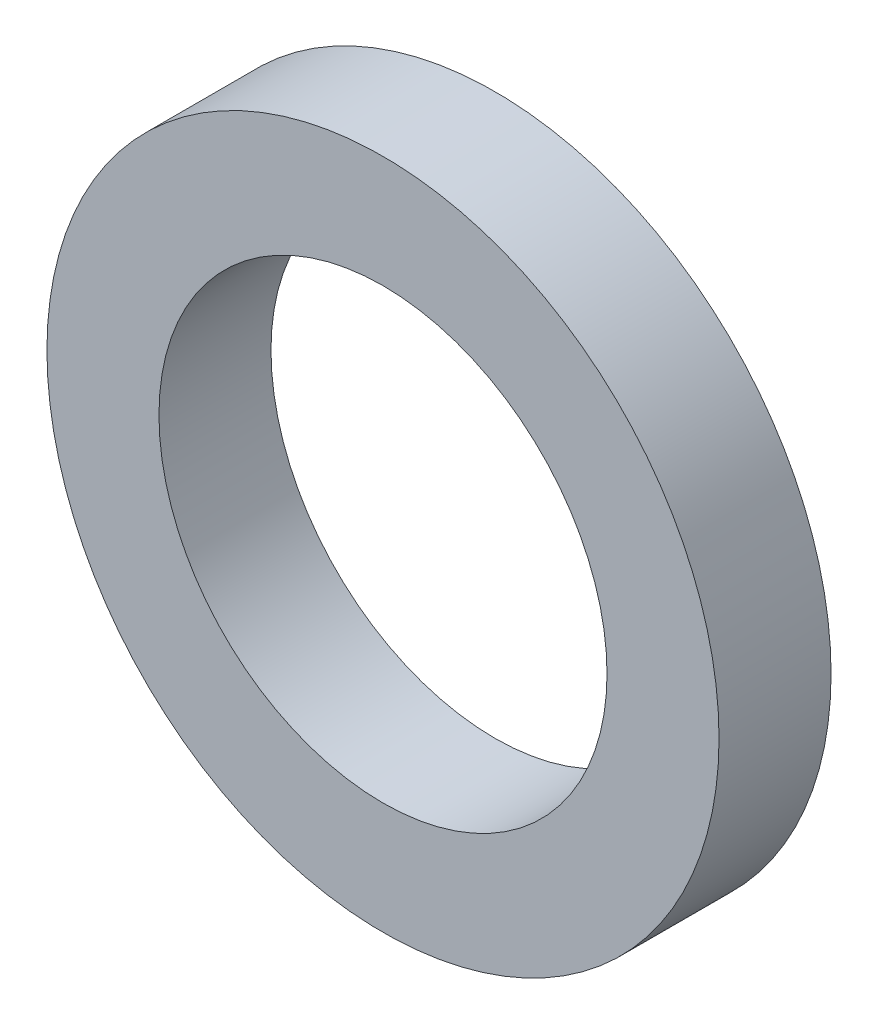
ISO-10303-21;
HEADER;
FILE_DESCRIPTION(('STEP AP214'),'2;1');
FILE_NAME('part.step','',(''),(''),'','','');
FILE_SCHEMA(('AUTOMOTIVE_DESIGN { 1 0 10303 214 1 1 1 1 }'));
ENDSEC;
DATA;
#1=APPLICATION_CONTEXT('core data for automotive mechanical design processes');
#2=APPLICATION_PROTOCOL_DEFINITION('international standard','automotive_design',2000,#1);
#3=PRODUCT_CONTEXT('',#1,'mechanical');
#4=PRODUCT('Part','Part','',(#3));
#5=PRODUCT_RELATED_PRODUCT_CATEGORY('part','',(#4));
#6=PRODUCT_DEFINITION_FORMATION('','',#4);
#7=PRODUCT_DEFINITION_CONTEXT('part definition',#1,'design');
#8=PRODUCT_DEFINITION('design','',#6,#7);
#9=PRODUCT_DEFINITION_SHAPE('','',#8);
#10=(LENGTH_UNIT() NAMED_UNIT(*) SI_UNIT(.MILLI.,.METRE.));
#11=(NAMED_UNIT(*) PLANE_ANGLE_UNIT() SI_UNIT($,.RADIAN.));
#12=(NAMED_UNIT(*) SI_UNIT($,.STERADIAN.) SOLID_ANGLE_UNIT());
#13=UNCERTAINTY_MEASURE_WITH_UNIT(LENGTH_MEASURE(1.E-05),#10,'distance_accuracy_value','');
#14=(GEOMETRIC_REPRESENTATION_CONTEXT(3) GLOBAL_UNCERTAINTY_ASSIGNED_CONTEXT((#13)) GLOBAL_UNIT_ASSIGNED_CONTEXT((#10,
#11,#12)) REPRESENTATION_CONTEXT('',''));
#15=CARTESIAN_POINT('',(0.,0.,0.));
#16=DIRECTION('',(0.,0.,1.));
#17=DIRECTION('',(1.,0.,0.));
#18=AXIS2_PLACEMENT_3D('',#15,#16,#17);
#19=CARTESIAN_POINT('',(2.,0.,0.365));
#20=DIRECTION('',(0.,0.,1.));
#21=DIRECTION('',(1.,0.,0.));
#22=AXIS2_PLACEMENT_3D('',#19,#20,#21);
#23=PLANE('',#22);
#24=CARTESIAN_POINT('',(0.,0.,0.365));
#25=DIRECTION('',(0.,0.,1.));
#26=DIRECTION('',(1.,0.,0.));
#27=AXIS2_PLACEMENT_3D('',#24,#25,#26);
#28=CIRCLE('',#27,3.);
#29=CARTESIAN_POINT('',(3.,0.,0.365));
#30=VERTEX_POINT('',#29);
#31=EDGE_CURVE('E10',#30,#30,#28,.T.);
#32=ORIENTED_EDGE('',*,*,#31,.T.);
#33=EDGE_LOOP('',(#32));
#34=FACE_BOUND('',#33,.T.);
#35=CARTESIAN_POINT('',(0.,0.,0.365));
#36=DIRECTION('',(0.,0.,1.));
#37=DIRECTION('',(1.,0.,0.));
#38=AXIS2_PLACEMENT_3D('',#35,#36,#37);
#39=CIRCLE('',#38,2.);
#40=CARTESIAN_POINT('',(2.,0.,0.365));
#41=VERTEX_POINT('',#40);
#42=EDGE_CURVE('E46',#41,#41,#39,.T.);
#43=ORIENTED_EDGE('',*,*,#42,.F.);
#44=EDGE_LOOP('',(#43));
#45=FACE_BOUND('',#44,.T.);
#46=ADVANCED_FACE('F32',(#34,#45),#23,.T.);
#47=CARTESIAN_POINT('',(0.,0.,0.635));
#48=DIRECTION('',(0.,0.,1.));
#49=DIRECTION('',(1.,0.,0.));
#50=AXIS2_PLACEMENT_3D('',#47,#48,#49);
#51=CYLINDRICAL_SURFACE('',#50,3.);
#52=CARTESIAN_POINT('',(0.,0.,-0.635));
#53=DIRECTION('',(0.,0.,1.));
#54=DIRECTION('',(1.,0.,0.));
#55=AXIS2_PLACEMENT_3D('',#52,#53,#54);
#56=CIRCLE('',#55,3.);
#57=CARTESIAN_POINT('',(3.,0.,-0.635));
#58=VERTEX_POINT('',#57);
#59=EDGE_CURVE('E38',#58,#58,#56,.T.);
#60=ORIENTED_EDGE('',*,*,#59,.T.);
#61=EDGE_LOOP('',(#60));
#62=FACE_BOUND('',#61,.T.);
#63=ORIENTED_EDGE('',*,*,#31,.F.);
#64=EDGE_LOOP('',(#63));
#65=FACE_BOUND('',#64,.T.);
#66=ADVANCED_FACE('F56',(#62,#65),#51,.T.);
#67=CARTESIAN_POINT('',(2.,0.,-0.635));
#68=DIRECTION('',(0.,0.,-1.));
#69=DIRECTION('',(-1.,0.,0.));
#70=AXIS2_PLACEMENT_3D('',#67,#68,#69);
#71=PLANE('',#70);
#72=CARTESIAN_POINT('',(0.,0.,-0.635));
#73=DIRECTION('',(0.,0.,1.));
#74=DIRECTION('',(1.,0.,0.));
#75=AXIS2_PLACEMENT_3D('',#72,#73,#74);
#76=CIRCLE('',#75,2.);
#77=CARTESIAN_POINT('',(2.,0.,-0.635));
#78=VERTEX_POINT('',#77);
#79=EDGE_CURVE('E42',#78,#78,#76,.T.);
#80=ORIENTED_EDGE('',*,*,#79,.T.);
#81=EDGE_LOOP('',(#80));
#82=FACE_BOUND('',#81,.T.);
#83=ORIENTED_EDGE('',*,*,#59,.F.);
#84=EDGE_LOOP('',(#83));
#85=FACE_BOUND('',#84,.T.);
#86=ADVANCED_FACE('F60',(#82,#85),#71,.T.);
#87=CARTESIAN_POINT('',(0.,0.,0.635));
#88=DIRECTION('',(0.,0.,1.));
#89=DIRECTION('',(1.,0.,0.));
#90=AXIS2_PLACEMENT_3D('',#87,#88,#89);
#91=CYLINDRICAL_SURFACE('',#90,2.);
#92=ORIENTED_EDGE('',*,*,#42,.T.);
#93=EDGE_LOOP('',(#92));
#94=FACE_BOUND('',#93,.T.);
#95=ORIENTED_EDGE('',*,*,#79,.F.);
#96=EDGE_LOOP('',(#95));
#97=FACE_BOUND('',#96,.T.);
#98=ADVANCED_FACE('F52',(#94,#97),#91,.F.);
#99=CLOSED_SHELL('',(#46,#66,#86,#98));
#100=MANIFOLD_SOLID_BREP('B2',#99);
#101=ADVANCED_BREP_SHAPE_REPRESENTATION('',(#18,#100),#14);
#102=SHAPE_DEFINITION_REPRESENTATION(#9,#101);
ENDSEC;
END-ISO-10303-21;
